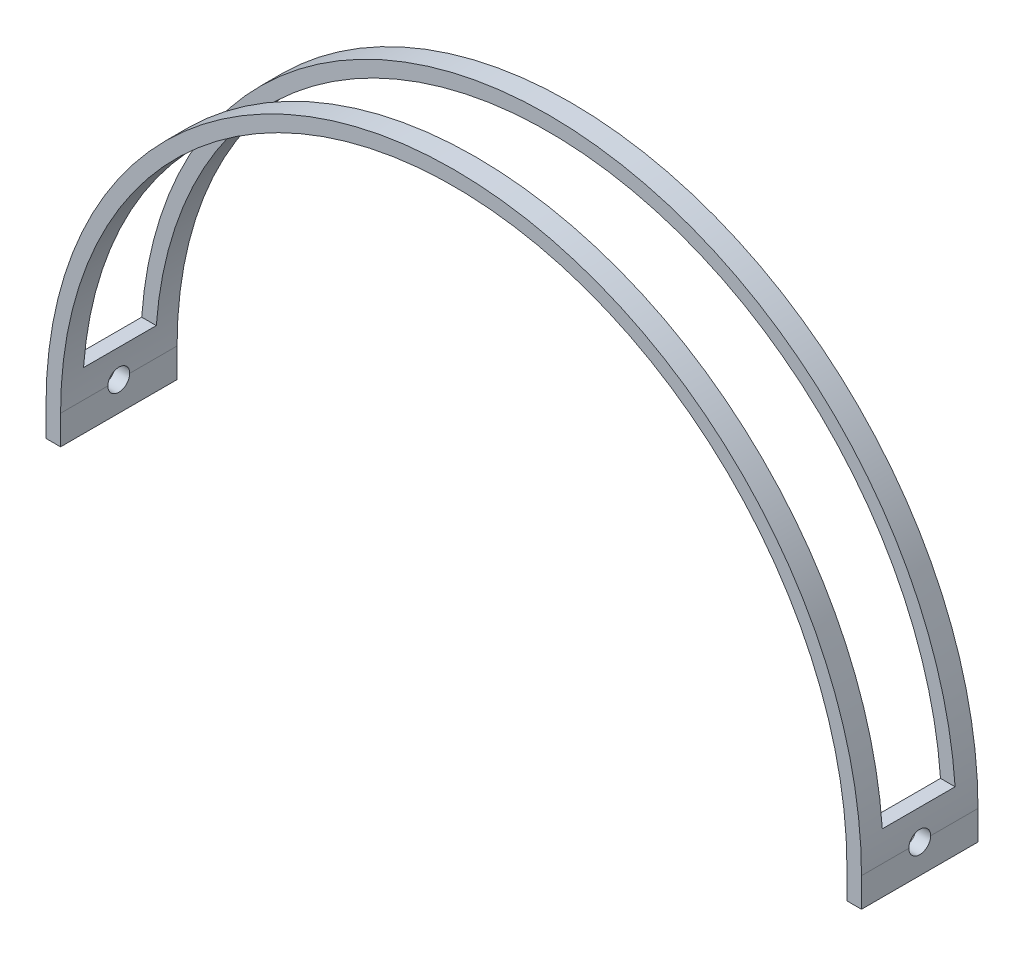
ISO-10303-21;
HEADER;
FILE_DESCRIPTION(('STEP AP214'),'2;1');
FILE_NAME('part.step','',(''),(''),'','','');
FILE_SCHEMA(('AUTOMOTIVE_DESIGN { 1 0 10303 214 1 1 1 1 }'));
ENDSEC;
DATA;
#1=APPLICATION_CONTEXT('core data for automotive mechanical design processes');
#2=APPLICATION_PROTOCOL_DEFINITION('international standard','automotive_design',2000,#1);
#3=PRODUCT_CONTEXT('',#1,'mechanical');
#4=PRODUCT('Part','Part','',(#3));
#5=PRODUCT_RELATED_PRODUCT_CATEGORY('part','',(#4));
#6=PRODUCT_DEFINITION_FORMATION('','',#4);
#7=PRODUCT_DEFINITION_CONTEXT('part definition',#1,'design');
#8=PRODUCT_DEFINITION('design','',#6,#7);
#9=PRODUCT_DEFINITION_SHAPE('','',#8);
#10=(LENGTH_UNIT() NAMED_UNIT(*) SI_UNIT(.MILLI.,.METRE.));
#11=(NAMED_UNIT(*) PLANE_ANGLE_UNIT() SI_UNIT($,.RADIAN.));
#12=(NAMED_UNIT(*) SI_UNIT($,.STERADIAN.) SOLID_ANGLE_UNIT());
#13=UNCERTAINTY_MEASURE_WITH_UNIT(LENGTH_MEASURE(1.E-05),#10,'distance_accuracy_value','');
#14=(GEOMETRIC_REPRESENTATION_CONTEXT(3) GLOBAL_UNCERTAINTY_ASSIGNED_CONTEXT((#13)) GLOBAL_UNIT_ASSIGNED_CONTEXT((#10,
#11,#12)) REPRESENTATION_CONTEXT('',''));
#15=CARTESIAN_POINT('',(0.,0.,0.));
#16=DIRECTION('',(0.,0.,1.));
#17=DIRECTION('',(1.,0.,0.));
#18=AXIS2_PLACEMENT_3D('',#15,#16,#17);
#19=CARTESIAN_POINT('',(0.,0.,80.));
#20=DIRECTION('',(0.,0.,-1.));
#21=DIRECTION('',(-1.,0.,0.));
#22=AXIS2_PLACEMENT_3D('',#19,#20,#21);
#23=CYLINDRICAL_SURFACE('',#22,270.);
#24=DIRECTION('',(0.,0.,-1.));
#25=VECTOR('',#24,1.);
#26=CARTESIAN_POINT('',(269.258240356725,20.,80.));
#27=LINE('',#26,#25);
#28=CARTESIAN_POINT('',(269.258240356725,20.,65.));
#29=VERTEX_POINT('',#28);
#30=CARTESIAN_POINT('',(269.258240356725,20.,15.));
#31=VERTEX_POINT('',#30);
#32=EDGE_CURVE('E149',#29,#31,#27,.T.);
#33=ORIENTED_EDGE('',*,*,#32,.T.);
#34=CARTESIAN_POINT('',(0.,0.,15.));
#35=DIRECTION('',(0.,0.,-1.));
#36=DIRECTION('',(0.,1.,0.));
#37=AXIS2_PLACEMENT_3D('',#34,#35,#36);
#38=CIRCLE('',#37,270.);
#39=CARTESIAN_POINT('',(-269.258240356725,20.,15.));
#40=VERTEX_POINT('',#39);
#41=EDGE_CURVE('E163',#31,#40,#38,.F.);
#42=ORIENTED_EDGE('',*,*,#41,.T.);
#43=DIRECTION('',(0.,0.,-1.));
#44=VECTOR('',#43,1.);
#45=CARTESIAN_POINT('',(-269.258240356725,20.,80.));
#46=LINE('',#45,#44);
#47=CARTESIAN_POINT('',(-269.258240356725,20.,65.));
#48=VERTEX_POINT('',#47);
#49=EDGE_CURVE('E155',#40,#48,#46,.F.);
#50=ORIENTED_EDGE('',*,*,#49,.T.);
#51=CARTESIAN_POINT('',(0.,0.,65.));
#52=DIRECTION('',(0.,0.,1.));
#53=DIRECTION('',(0.,-1.,0.));
#54=AXIS2_PLACEMENT_3D('',#51,#52,#53);
#55=CIRCLE('',#54,270.);
#56=EDGE_CURVE('E144',#48,#29,#55,.F.);
#57=ORIENTED_EDGE('',*,*,#56,.T.);
#58=EDGE_LOOP('',(#33,#42,#50,#57));
#59=FACE_BOUND('',#58,.T.);
#60=DIRECTION('',(0.,0.,-1.));
#61=VECTOR('',#60,1.);
#62=CARTESIAN_POINT('',(270.,0.,80.));
#63=LINE('',#62,#61);
#64=CARTESIAN_POINT('',(270.,0.,32.5));
#65=VERTEX_POINT('',#64);
#66=CARTESIAN_POINT('',(270.,0.,0.));
#67=VERTEX_POINT('',#66);
#68=EDGE_CURVE('E241',#65,#67,#63,.T.);
#69=ORIENTED_EDGE('',*,*,#68,.F.);
#70=CARTESIAN_POINT('',(270.,0.,32.5));
#71=CARTESIAN_POINT('',(270.000002490355,0.210896671625209,32.4999772748572));
#72=CARTESIAN_POINT('',(269.999752988114,0.421790022561387,32.5088945265499));
#73=CARTESIAN_POINT('',(269.998767996086,0.842067134340722,32.5444448063949));
#74=CARTESIAN_POINT('',(269.998032530259,1.05145096909655,32.5710769611086));
#75=CARTESIAN_POINT('',(269.99609430199,1.46707781561305,32.6418674581378));
#76=CARTESIAN_POINT('',(269.994891875695,1.67332297604451,32.6860131936302));
#77=CARTESIAN_POINT('',(269.992054596659,2.08135936270014,32.7915090379145));
#78=CARTESIAN_POINT('',(269.990419749043,2.28315064167234,32.8528589428366));
#79=CARTESIAN_POINT('',(269.98676325086,2.68090410203583,32.9923482114205));
#80=CARTESIAN_POINT('',(269.984741492465,2.87686464083203,33.0704922561711));
#81=CARTESIAN_POINT('',(269.980368059072,3.26157709995361,33.2430351156936));
#82=CARTESIAN_POINT('',(269.978016262452,3.45032633006901,33.3374399256499));
#83=CARTESIAN_POINT('',(269.973051002591,3.81912758752038,33.5417735222238));
#84=CARTESIAN_POINT('',(269.970437640094,3.99918292407978,33.6516963385835));
#85=CARTESIAN_POINT('',(269.9650225652,4.34939856627714,33.8863139688));
#86=CARTESIAN_POINT('',(269.962220849825,4.51955871538725,34.0110090162379));
#87=CARTESIAN_POINT('',(269.956507857027,4.84881315928157,34.2743160663547));
#88=CARTESIAN_POINT('',(269.95359655318,5.00790475863382,34.4129314389933));
#89=CARTESIAN_POINT('',(269.947747549879,5.3138506982294,34.7030727741305));
#90=CARTESIAN_POINT('',(269.944809849799,5.4607047476853,34.8545990432437));
#91=CARTESIAN_POINT('',(269.938991570705,5.74112384240071,35.1694781303519));
#92=CARTESIAN_POINT('',(269.936110989842,5.87468931824805,35.3328305648487));
#93=CARTESIAN_POINT('',(269.930487615895,6.12763170232405,35.6702649605877));
#94=CARTESIAN_POINT('',(269.927744870873,6.24700368088501,35.8443506179859));
#95=CARTESIAN_POINT('',(269.922476767352,6.47062963500449,36.2019205178214));
#96=CARTESIAN_POINT('',(269.919951357087,6.57488721466033,36.3854025054926));
#97=CARTESIAN_POINT('',(269.915188019901,6.76761232018099,36.7605690317181));
#98=CARTESIAN_POINT('',(269.912950199163,6.85607401857797,36.9522565652899));
#99=CARTESIAN_POINT('',(269.908827273339,7.0165092565377,37.3423570956473));
#100=CARTESIAN_POINT('',(269.906942076783,7.08848707307027,37.5407683325029));
#101=CARTESIAN_POINT('',(269.903577214155,7.21547261851232,37.9429569701831));
#102=CARTESIAN_POINT('',(269.902097556531,7.27047999385168,38.1467344827152));
#103=CARTESIAN_POINT('',(269.899586198478,7.36311885456479,38.5581502315254));
#104=CARTESIAN_POINT('',(269.898554385139,7.40075471972331,38.7657874809201));
#105=CARTESIAN_POINT('',(269.896967490424,7.45840283010884,39.1834963248525));
#106=CARTESIAN_POINT('',(269.896412409614,7.47841505439742,39.3935679222821));
#107=CARTESIAN_POINT('',(269.895794747158,7.50067347247792,39.814657549159));
#108=CARTESIAN_POINT('',(269.895732180905,7.5029191109429,40.0256756079833));
#109=CARTESIAN_POINT('',(269.896101362578,7.48962702957873,40.4471459485791));
#110=CARTESIAN_POINT('',(269.896533099977,7.47408968839474,40.6575982423015));
#111=CARTESIAN_POINT('',(269.897878531865,7.42534557050848,41.07642279743));
#112=CARTESIAN_POINT('',(269.898792176307,7.39214062859547,41.2847952725375));
#113=CARTESIAN_POINT('',(269.901075039455,7.30831357705489,41.6979293464696));
#114=CARTESIAN_POINT('',(269.902444100896,7.25769747963791,41.9026921661129));
#115=CARTESIAN_POINT('',(269.905599301457,7.13939522458575,42.30726290104));
#116=CARTESIAN_POINT('',(269.907385516244,7.07170596988417,42.5070699101106));
#117=CARTESIAN_POINT('',(269.911324132071,6.91974547840534,42.9002664369441));
#118=CARTESIAN_POINT('',(269.913476524651,6.83547462470611,43.0936561028436));
#119=CARTESIAN_POINT('',(269.918086865011,6.65093217146744,43.4726847145102));
#120=CARTESIAN_POINT('',(269.920544869383,6.55065760743306,43.6583222162283));
#121=CARTESIAN_POINT('',(269.925696310504,6.33483361160142,44.0204873298012));
#122=CARTESIAN_POINT('',(269.928389743658,6.21928441312816,44.1970150807526));
#123=CARTESIAN_POINT('',(269.93393604824,5.97371320228065,44.5397354107952));
#124=CARTESIAN_POINT('',(269.936788942754,5.84368909174088,44.7059264861098));
#125=CARTESIAN_POINT('',(269.942571784152,5.57015605869184,45.0267061941021));
#126=CARTESIAN_POINT('',(269.945501702236,5.42665212654546,45.1812990827163));
#127=CARTESIAN_POINT('',(269.951358175564,5.127053103881,45.4779366273703));
#128=CARTESIAN_POINT('',(269.954284727994,4.97095098456519,45.619974184634));
#129=CARTESIAN_POINT('',(269.960048757042,4.64739073416951,45.8903473828512));
#130=CARTESIAN_POINT('',(269.962886264101,4.47993654705781,46.0186877430358));
#131=CARTESIAN_POINT('',(269.96839417829,4.13472536415256,46.2608725164716));
#132=CARTESIAN_POINT('',(269.97106450019,3.95696320089954,46.3747095660814));
#133=CARTESIAN_POINT('',(269.976160585946,3.59248192987508,46.5869985859129));
#134=CARTESIAN_POINT('',(269.978586357268,3.40576309578961,46.6854510258461));
#135=CARTESIAN_POINT('',(269.983126021495,3.02456854438496,46.8663324367272));
#136=CARTESIAN_POINT('',(269.985239712959,2.83008791896487,46.948751068985));
#137=CARTESIAN_POINT('',(269.989093215983,2.43486962561185,47.0968967286038));
#138=CARTESIAN_POINT('',(269.990833035759,2.23413209526456,47.1626241227049));
#139=CARTESIAN_POINT('',(269.993887427407,1.82809223962892,47.2768472496311));
#140=CARTESIAN_POINT('',(269.995202539664,1.62279607310506,47.325364887406));
#141=CARTESIAN_POINT('',(269.997372731815,1.20892631861051,47.4049218823215));
#142=CARTESIAN_POINT('',(269.998228037372,1.00035439012829,47.4359698135167));
#143=CARTESIAN_POINT('',(269.999226721046,0.659441838360513,47.4721226848181));
#144=CARTESIAN_POINT('',(269.999516613823,0.527646431958973,47.4825833201591));
#145=CARTESIAN_POINT('',(269.999903243148,0.263905249050726,47.496516985698));
#146=CARTESIAN_POINT('',(270.000000298562,0.131960082352581,47.5000015511986));
#147=CARTESIAN_POINT('',(270.,0.,47.5));
#148=B_SPLINE_CURVE_WITH_KNOTS('',3,(#70,#71,#72,#73,#74,#75,#76,#77,#78,#79,#80,#81,#82,#83,
#84,#85,#86,#87,#88,#89,#90,#91,#92,#93,#94,#95,#96,#97,#98,#99,#100,#101,#102,#103,#104,#105,
#106,#107,#108,#109,#110,#111,#112,#113,#114,#115,#116,#117,#118,#119,#120,#121,#122,#123,#124,
#125,#126,#127,#128,#129,#130,#131,#132,#133,#134,#135,#136,#137,#138,#139,#140,#141,#142,#143,
#144,#145,#146,#147),.UNSPECIFIED.,.F.,.F.,(4,2,2,2,2,2,2,2,2,2,2,2,2,2,2,2,2,2,2,2,2,2,2,2,2,2,
2,2,2,2,2,2,2,2,2,2,2,2,4),(0.,0.632496732573111,1.26496228201443,1.89697338664046,
2.52897700223854,3.16115700739397,3.7935705919644,4.42574152717239,5.0579224597101,
5.69025680702971,6.32260617553205,6.95493504742569,7.58748290140814,8.21987967249564,
8.85250926958298,9.48497453578103,10.1174529781665,10.7497718699665,11.3820915130155,
12.0144309202865,12.6467568636835,13.2790171525252,13.9110593356575,14.5432162536418,
15.1753585688733,15.8076181170683,16.4398680084508,17.0722096652576,17.7043181387103,
18.3367817499044,18.9690267438408,19.601591473592,20.2341368865742,20.8670888262903,
21.5000268575725,22.1321563561381,22.7639753371222,23.1604360053802,23.5562405615626),.UNSPECIFIED.);
#149=CARTESIAN_POINT('',(270.,0.,47.5));
#150=VERTEX_POINT('',#149);
#151=EDGE_CURVE('E456',#65,#150,#148,.T.);
#152=ORIENTED_EDGE('',*,*,#151,.T.);
#153=CARTESIAN_POINT('',(270.,0.,80.));
#154=VERTEX_POINT('',#153);
#155=EDGE_CURVE('E233',#154,#150,#63,.T.);
#156=ORIENTED_EDGE('',*,*,#155,.F.);
#157=CARTESIAN_POINT('',(0.,0.,80.));
#158=DIRECTION('',(0.,0.,-1.));
#159=DIRECTION('',(1.,0.,0.));
#160=AXIS2_PLACEMENT_3D('',#157,#158,#159);
#161=CIRCLE('',#160,270.);
#162=CARTESIAN_POINT('',(-270.,0.,80.));
#163=VERTEX_POINT('',#162);
#164=EDGE_CURVE('E401',#163,#154,#161,.T.);
#165=ORIENTED_EDGE('',*,*,#164,.F.);
#166=DIRECTION('',(0.,0.,-1.));
#167=VECTOR('',#166,1.);
#168=CARTESIAN_POINT('',(-270.,0.,80.));
#169=LINE('',#168,#167);
#170=CARTESIAN_POINT('',(-270.,0.,47.5));
#171=VERTEX_POINT('',#170);
#172=EDGE_CURVE('E396',#163,#171,#169,.T.);
#173=ORIENTED_EDGE('',*,*,#172,.T.);
#174=CARTESIAN_POINT('',(-270.,0.,47.5));
#175=CARTESIAN_POINT('',(-270.000002490355,0.210896671625175,47.5000227251428));
#176=CARTESIAN_POINT('',(-269.999752988114,0.421790022561354,47.4911054734501));
#177=CARTESIAN_POINT('',(-269.998767996086,0.842067134340689,47.4555551936051));
#178=CARTESIAN_POINT('',(-269.998032530259,1.05145096909652,47.4289230388914));
#179=CARTESIAN_POINT('',(-269.99609430199,1.46707781561301,47.3581325418622));
#180=CARTESIAN_POINT('',(-269.994891875695,1.67332297604447,47.3139868063698));
#181=CARTESIAN_POINT('',(-269.992054596659,2.08135936270011,47.2084909620855));
#182=CARTESIAN_POINT('',(-269.990419749043,2.2831506416723,47.1471410571634));
#183=CARTESIAN_POINT('',(-269.98676325086,2.6809041020358,47.0076517885795));
#184=CARTESIAN_POINT('',(-269.984741492465,2.87686464083199,46.929507743829));
#185=CARTESIAN_POINT('',(-269.980368059072,3.26157709995358,46.7569648843064));
#186=CARTESIAN_POINT('',(-269.978016262452,3.45032633006898,46.6625600743501));
#187=CARTESIAN_POINT('',(-269.973051002591,3.81912758752035,46.4582264777762));
#188=CARTESIAN_POINT('',(-269.970437640094,3.99918292407975,46.3483036614165));
#189=CARTESIAN_POINT('',(-269.9650225652,4.34939856627711,46.1136860312));
#190=CARTESIAN_POINT('',(-269.962220849825,4.51955871538722,45.9889909837621));
#191=CARTESIAN_POINT('',(-269.956507857027,4.84881315928154,45.7256839336453));
#192=CARTESIAN_POINT('',(-269.95359655318,5.00790475863379,45.5870685610068));
#193=CARTESIAN_POINT('',(-269.947747549879,5.31385069822937,45.2969272258695));
#194=CARTESIAN_POINT('',(-269.944809849799,5.46070474768528,45.1454009567563));
#195=CARTESIAN_POINT('',(-269.938991570705,5.74112384240068,44.8305218696482));
#196=CARTESIAN_POINT('',(-269.936110989842,5.87468931824803,44.6671694351513));
#197=CARTESIAN_POINT('',(-269.930487615895,6.12763170232403,44.3297350394123));
#198=CARTESIAN_POINT('',(-269.927744870873,6.24700368088499,44.1556493820141));
#199=CARTESIAN_POINT('',(-269.922476767352,6.47062963500447,43.7980794821786));
#200=CARTESIAN_POINT('',(-269.919951357087,6.57488721466031,43.6145974945075));
#201=CARTESIAN_POINT('',(-269.915188019901,6.76761232018097,43.239430968282));
#202=CARTESIAN_POINT('',(-269.912950199163,6.85607401857795,43.0477434347101));
#203=CARTESIAN_POINT('',(-269.908827273339,7.01650925653769,42.6576429043527));
#204=CARTESIAN_POINT('',(-269.906942076783,7.08848707307026,42.4592316674971));
#205=CARTESIAN_POINT('',(-269.903577214155,7.2154726185123,42.0570430298169));
#206=CARTESIAN_POINT('',(-269.902097556531,7.27047999385167,41.8532655172848));
#207=CARTESIAN_POINT('',(-269.899586198478,7.36311885456479,41.4418497684746));
#208=CARTESIAN_POINT('',(-269.898554385139,7.40075471972331,41.2342125190799));
#209=CARTESIAN_POINT('',(-269.896967490424,7.45840283010883,40.8165036751475));
#210=CARTESIAN_POINT('',(-269.896412409614,7.47841505439742,40.6064320777179));
#211=CARTESIAN_POINT('',(-269.895794747158,7.50067347247792,40.1853424508411));
#212=CARTESIAN_POINT('',(-269.895732180905,7.5029191109429,39.9743243920168));
#213=CARTESIAN_POINT('',(-269.896101362578,7.48962702957873,39.552854051421));
#214=CARTESIAN_POINT('',(-269.896533099977,7.47408968839474,39.3424017576985));
#215=CARTESIAN_POINT('',(-269.897878531865,7.42534557050849,38.92357720257));
#216=CARTESIAN_POINT('',(-269.898792176307,7.39214062859548,38.7152047274625));
#217=CARTESIAN_POINT('',(-269.901075039455,7.3083135770549,38.3020706535304));
#218=CARTESIAN_POINT('',(-269.902444100896,7.25769747963792,38.0973078338872));
#219=CARTESIAN_POINT('',(-269.905599301457,7.13939522458576,37.6927370989601));
#220=CARTESIAN_POINT('',(-269.907385516244,7.07170596988418,37.4929300898894));
#221=CARTESIAN_POINT('',(-269.911324132071,6.91974547840535,37.0997335630559));
#222=CARTESIAN_POINT('',(-269.913476524651,6.83547462470612,36.9063438971564));
#223=CARTESIAN_POINT('',(-269.918086865011,6.65093217146745,36.5273152854899));
#224=CARTESIAN_POINT('',(-269.920544869383,6.55065760743307,36.3416777837717));
#225=CARTESIAN_POINT('',(-269.925696310504,6.33483361160144,35.9795126701988));
#226=CARTESIAN_POINT('',(-269.928389743658,6.21928441312818,35.8029849192474));
#227=CARTESIAN_POINT('',(-269.93393604824,5.97371320228067,35.4602645892049));
#228=CARTESIAN_POINT('',(-269.936788942754,5.8436890917409,35.2940735138903));
#229=CARTESIAN_POINT('',(-269.942571784152,5.57015605869187,34.9732938058979));
#230=CARTESIAN_POINT('',(-269.945501702236,5.42665212654549,34.8187009172837));
#231=CARTESIAN_POINT('',(-269.951358175564,5.12705310388103,34.5220633726298));
#232=CARTESIAN_POINT('',(-269.954284727994,4.97095098456521,34.380025815366));
#233=CARTESIAN_POINT('',(-269.960048757042,4.64739073416953,34.1096526171488));
#234=CARTESIAN_POINT('',(-269.962886264101,4.47993654705783,33.9813122569642));
#235=CARTESIAN_POINT('',(-269.96839417829,4.13472536415259,33.7391274835284));
#236=CARTESIAN_POINT('',(-269.97106450019,3.95696320089957,33.6252904339186));
#237=CARTESIAN_POINT('',(-269.976160585946,3.59248192987511,33.4130014140871));
#238=CARTESIAN_POINT('',(-269.978586357268,3.40576309578964,33.314548974154));
#239=CARTESIAN_POINT('',(-269.983126021495,3.02456854438499,33.1336675632729));
#240=CARTESIAN_POINT('',(-269.985239712959,2.83008791896491,33.051248931015));
#241=CARTESIAN_POINT('',(-269.989093215983,2.43486962561188,32.9031032713962));
#242=CARTESIAN_POINT('',(-269.990833035759,2.23413209526459,32.8373758772951));
#243=CARTESIAN_POINT('',(-269.993887427407,1.82809223962896,32.7231527503689));
#244=CARTESIAN_POINT('',(-269.995202539664,1.62279607310509,32.674635112594));
#245=CARTESIAN_POINT('',(-269.997372731815,1.20892631861055,32.5950781176785));
#246=CARTESIAN_POINT('',(-269.998228037372,1.00035439012833,32.5640301864834));
#247=CARTESIAN_POINT('',(-269.999226721046,0.659441838360539,32.5278773151819));
#248=CARTESIAN_POINT('',(-269.999516613823,0.527646431958987,32.5174166798409));
#249=CARTESIAN_POINT('',(-269.999903243148,0.263905249050718,32.503483014302));
#250=CARTESIAN_POINT('',(-270.000000298562,0.13196008235256,32.4999984488014));
#251=CARTESIAN_POINT('',(-270.,0.,32.5));
#252=B_SPLINE_CURVE_WITH_KNOTS('',3,(#174,#175,#176,#177,#178,#179,#180,#181,#182,#183,#184,
#185,#186,#187,#188,#189,#190,#191,#192,#193,#194,#195,#196,#197,#198,#199,#200,#201,#202,#203,
#204,#205,#206,#207,#208,#209,#210,#211,#212,#213,#214,#215,#216,#217,#218,#219,#220,#221,#222,
#223,#224,#225,#226,#227,#228,#229,#230,#231,#232,#233,#234,#235,#236,#237,#238,#239,#240,#241,
#242,#243,#244,#245,#246,#247,#248,#249,#250,#251),.UNSPECIFIED.,.F.,.F.,(4,2,2,2,2,2,2,2,2,2,2,
2,2,2,2,2,2,2,2,2,2,2,2,2,2,2,2,2,2,2,2,2,2,2,2,2,2,2,4),(0.,0.632496732573112,1.26496228201443,
1.89697338664046,2.52897700223854,3.16115700739396,3.7935705919644,4.42574152717239,
5.0579224597101,5.69025680702972,6.32260617553205,6.95493504742569,7.58748290140814,
8.21987967249563,8.85250926958297,9.48497453578102,10.1174529781665,10.7497718699665,
11.3820915130155,12.0144309202865,12.6467568636834,13.2790171525252,13.9110593356575,
14.5432162536418,15.1753585688733,15.8076181170683,16.4398680084508,17.0722096652576,
17.7043181387103,18.3367817499044,18.9690267438408,19.601591473592,20.2341368865742,
20.8670888262903,21.5000268575725,22.1321563561381,22.7639753371222,23.1604360053802,
23.5562405615626),.UNSPECIFIED.);
#253=CARTESIAN_POINT('',(-270.,0.,32.5));
#254=VERTEX_POINT('',#253);
#255=EDGE_CURVE('E172',#171,#254,#252,.T.);
#256=ORIENTED_EDGE('',*,*,#255,.T.);
#257=CARTESIAN_POINT('',(-270.,0.,0.));
#258=VERTEX_POINT('',#257);
#259=EDGE_CURVE('E407',#254,#258,#169,.T.);
#260=ORIENTED_EDGE('',*,*,#259,.T.);
#261=CARTESIAN_POINT('',(0.,0.,0.));
#262=DIRECTION('',(0.,0.,-1.));
#263=DIRECTION('',(1.,0.,0.));
#264=AXIS2_PLACEMENT_3D('',#261,#262,#263);
#265=CIRCLE('',#264,270.);
#266=EDGE_CURVE('E400',#258,#67,#265,.T.);
#267=ORIENTED_EDGE('',*,*,#266,.T.);
#268=EDGE_LOOP('',(#69,#152,#156,#165,#173,#256,#260,#267));
#269=FACE_BOUND('',#268,.T.);
#270=ADVANCED_FACE('F35',(#59,#269),#23,.F.);
#271=CARTESIAN_POINT('',(270.,0.,80.));
#272=DIRECTION('',(1.,0.,0.));
#273=DIRECTION('',(0.,0.,-1.));
#274=AXIS2_PLACEMENT_3D('',#271,#272,#273);
#275=PLANE('',#274);
#276=ORIENTED_EDGE('',*,*,#155,.T.);
#277=CARTESIAN_POINT('',(270.,0.,40.));
#278=DIRECTION('',(1.,0.,0.));
#279=DIRECTION('',(0.,0.,-1.));
#280=AXIS2_PLACEMENT_3D('',#277,#278,#279);
#281=CIRCLE('',#280,7.5);
#282=EDGE_CURVE('E207',#150,#65,#281,.T.);
#283=ORIENTED_EDGE('',*,*,#282,.T.);
#284=ORIENTED_EDGE('',*,*,#68,.T.);
#285=DIRECTION('',(0.,-1.,0.));
#286=VECTOR('',#285,1.);
#287=CARTESIAN_POINT('',(270.,0.,0.));
#288=LINE('',#287,#286);
#289=CARTESIAN_POINT('',(270.,-20.,0.));
#290=VERTEX_POINT('',#289);
#291=EDGE_CURVE('E428',#67,#290,#288,.T.);
#292=ORIENTED_EDGE('',*,*,#291,.T.);
#293=DIRECTION('',(0.,0.,-1.));
#294=VECTOR('',#293,1.);
#295=CARTESIAN_POINT('',(270.,-20.,80.));
#296=LINE('',#295,#294);
#297=CARTESIAN_POINT('',(270.,-20.,80.));
#298=VERTEX_POINT('',#297);
#299=EDGE_CURVE('E246',#298,#290,#296,.T.);
#300=ORIENTED_EDGE('',*,*,#299,.F.);
#301=DIRECTION('',(0.,-1.,0.));
#302=VECTOR('',#301,1.);
#303=CARTESIAN_POINT('',(270.,0.,80.));
#304=LINE('',#303,#302);
#305=EDGE_CURVE('E236',#154,#298,#304,.T.);
#306=ORIENTED_EDGE('',*,*,#305,.F.);
#307=EDGE_LOOP('',(#276,#283,#284,#292,#300,#306));
#308=FACE_BOUND('',#307,.T.);
#309=ADVANCED_FACE('F223',(#308),#275,.F.);
#310=CARTESIAN_POINT('',(270.,-20.,80.));
#311=DIRECTION('',(0.,1.,0.));
#312=DIRECTION('',(0.,0.,1.));
#313=AXIS2_PLACEMENT_3D('',#310,#311,#312);
#314=PLANE('',#313);
#315=DIRECTION('',(1.,0.,0.));
#316=VECTOR('',#315,1.);
#317=CARTESIAN_POINT('',(270.,-20.,0.));
#318=LINE('',#317,#316);
#319=CARTESIAN_POINT('',(280.,-20.,0.));
#320=VERTEX_POINT('',#319);
#321=EDGE_CURVE('E426',#290,#320,#318,.T.);
#322=ORIENTED_EDGE('',*,*,#321,.T.);
#323=DIRECTION('',(0.,0.,-1.));
#324=VECTOR('',#323,1.);
#325=CARTESIAN_POINT('',(280.,-20.,80.));
#326=LINE('',#325,#324);
#327=CARTESIAN_POINT('',(280.,-20.,80.));
#328=VERTEX_POINT('',#327);
#329=EDGE_CURVE('E417',#328,#320,#326,.T.);
#330=ORIENTED_EDGE('',*,*,#329,.F.);
#331=DIRECTION('',(1.,0.,0.));
#332=VECTOR('',#331,1.);
#333=CARTESIAN_POINT('',(270.,-20.,80.));
#334=LINE('',#333,#332);
#335=EDGE_CURVE('E427',#298,#328,#334,.T.);
#336=ORIENTED_EDGE('',*,*,#335,.F.);
#337=ORIENTED_EDGE('',*,*,#299,.T.);
#338=EDGE_LOOP('',(#322,#330,#336,#337));
#339=FACE_BOUND('',#338,.T.);
#340=ADVANCED_FACE('F220',(#339),#314,.F.);
#341=CARTESIAN_POINT('',(280.,0.,80.));
#342=DIRECTION('',(-1.,0.,0.));
#343=DIRECTION('',(0.,0.,1.));
#344=AXIS2_PLACEMENT_3D('',#341,#342,#343);
#345=PLANE('',#344);
#346=DIRECTION('',(0.,0.,-1.));
#347=VECTOR('',#346,1.);
#348=CARTESIAN_POINT('',(280.,0.,80.));
#349=LINE('',#348,#347);
#350=CARTESIAN_POINT('',(280.,0.,32.5));
#351=VERTEX_POINT('',#350);
#352=CARTESIAN_POINT('',(280.,0.,0.));
#353=VERTEX_POINT('',#352);
#354=EDGE_CURVE('E414',#351,#353,#349,.T.);
#355=ORIENTED_EDGE('',*,*,#354,.F.);
#356=CARTESIAN_POINT('',(280.,0.,40.));
#357=DIRECTION('',(1.,0.,0.));
#358=DIRECTION('',(0.,0.,-1.));
#359=AXIS2_PLACEMENT_3D('',#356,#357,#358);
#360=CIRCLE('',#359,7.5);
#361=CARTESIAN_POINT('',(280.,0.,47.5));
#362=VERTEX_POINT('',#361);
#363=EDGE_CURVE('E165',#362,#351,#360,.T.);
#364=ORIENTED_EDGE('',*,*,#363,.F.);
#365=CARTESIAN_POINT('',(280.,0.,80.));
#366=VERTEX_POINT('',#365);
#367=EDGE_CURVE('E415',#366,#362,#349,.T.);
#368=ORIENTED_EDGE('',*,*,#367,.F.);
#369=DIRECTION('',(0.,1.,0.));
#370=VECTOR('',#369,1.);
#371=CARTESIAN_POINT('',(280.,0.,80.));
#372=LINE('',#371,#370);
#373=EDGE_CURVE('E448',#328,#366,#372,.T.);
#374=ORIENTED_EDGE('',*,*,#373,.F.);
#375=ORIENTED_EDGE('',*,*,#329,.T.);
#376=DIRECTION('',(0.,1.,0.));
#377=VECTOR('',#376,1.);
#378=CARTESIAN_POINT('',(280.,0.,0.));
#379=LINE('',#378,#377);
#380=EDGE_CURVE('E430',#320,#353,#379,.T.);
#381=ORIENTED_EDGE('',*,*,#380,.T.);
#382=EDGE_LOOP('',(#355,#364,#368,#374,#375,#381));
#383=FACE_BOUND('',#382,.T.);
#384=ADVANCED_FACE('F214',(#383),#345,.F.);
#385=CARTESIAN_POINT('',(0.,0.,80.));
#386=DIRECTION('',(0.,0.,-1.));
#387=DIRECTION('',(-1.,0.,0.));
#388=AXIS2_PLACEMENT_3D('',#385,#386,#387);
#389=CYLINDRICAL_SURFACE('',#388,280.);
#390=CARTESIAN_POINT('',(0.,0.,15.));
#391=DIRECTION('',(0.,0.,-1.));
#392=DIRECTION('',(0.,1.,0.));
#393=AXIS2_PLACEMENT_3D('',#390,#391,#392);
#394=CIRCLE('',#393,280.);
#395=CARTESIAN_POINT('',(-279.284800875379,20.,15.));
#396=VERTEX_POINT('',#395);
#397=CARTESIAN_POINT('',(279.284800875379,20.,15.));
#398=VERTEX_POINT('',#397);
#399=EDGE_CURVE('E11',#396,#398,#394,.T.);
#400=ORIENTED_EDGE('',*,*,#399,.T.);
#401=DIRECTION('',(0.,0.,-1.));
#402=VECTOR('',#401,1.);
#403=CARTESIAN_POINT('',(279.284800875379,20.,80.));
#404=LINE('',#403,#402);
#405=CARTESIAN_POINT('',(279.284800875379,20.,65.));
#406=VERTEX_POINT('',#405);
#407=EDGE_CURVE('E251',#398,#406,#404,.F.);
#408=ORIENTED_EDGE('',*,*,#407,.T.);
#409=CARTESIAN_POINT('',(0.,0.,65.));
#410=DIRECTION('',(0.,0.,1.));
#411=DIRECTION('',(0.,-1.,0.));
#412=AXIS2_PLACEMENT_3D('',#409,#410,#411);
#413=CIRCLE('',#412,280.);
#414=CARTESIAN_POINT('',(-279.284800875379,20.,65.));
#415=VERTEX_POINT('',#414);
#416=EDGE_CURVE('E244',#406,#415,#413,.T.);
#417=ORIENTED_EDGE('',*,*,#416,.T.);
#418=DIRECTION('',(0.,0.,-1.));
#419=VECTOR('',#418,1.);
#420=CARTESIAN_POINT('',(-279.284800875379,20.,80.));
#421=LINE('',#420,#419);
#422=EDGE_CURVE('E43',#415,#396,#421,.T.);
#423=ORIENTED_EDGE('',*,*,#422,.T.);
#424=EDGE_LOOP('',(#400,#408,#417,#423));
#425=FACE_BOUND('',#424,.T.);
#426=ORIENTED_EDGE('',*,*,#367,.T.);
#427=CARTESIAN_POINT('',(280.,0.,47.5));
#428=CARTESIAN_POINT('',(280.00000240153,0.210899699288154,47.5000227219922));
#429=CARTESIAN_POINT('',(279.999761803127,0.421796082105779,47.4911052178454));
#430=CARTESIAN_POINT('',(279.998811962089,0.842079291744775,47.4555539088124));
#431=CARTESIAN_POINT('',(279.998102742512,1.05146619232869,47.4289209756243));
#432=CARTESIAN_POINT('',(279.996233682274,1.46709941666009,47.3581283331769));
#433=CARTESIAN_POINT('',(279.995074165261,1.6733478857448,47.3139812116495));
#434=CARTESIAN_POINT('',(279.992338136932,2.08139086617777,47.2084819714669));
#435=CARTESIAN_POINT('',(279.990761630566,2.28318543036845,47.147130057053));
#436=CARTESIAN_POINT('',(279.987235619577,2.68094548340308,47.0076360757864));
#437=CARTESIAN_POINT('',(279.985286010787,2.87690932665352,46.9294893191795));
#438=CARTESIAN_POINT('',(279.981068654263,3.26162821446627,46.7569403416919));
#439=CARTESIAN_POINT('',(279.97880078925,3.45038056876214,46.6625321253943));
#440=CARTESIAN_POINT('',(279.974012738939,3.81918769794875,46.4581910719778));
#441=CARTESIAN_POINT('',(279.971492650884,3.99924578545633,46.3482642112904));
#442=CARTESIAN_POINT('',(279.966270858039,4.34946648822376,46.113637865492));
#443=CARTESIAN_POINT('',(279.963569150383,4.51962894715432,45.9889381470967));
#444=CARTESIAN_POINT('',(279.958060145081,4.84888465522169,45.7256234274722));
#445=CARTESIAN_POINT('',(279.955252823728,5.00797539580363,45.5870052899688));
#446=CARTESIAN_POINT('',(279.949612746509,5.31391933223625,45.2968584184432));
#447=CARTESIAN_POINT('',(279.946779990041,5.46077223742692,45.1453293779479));
#448=CARTESIAN_POINT('',(279.941169577679,5.74118870116377,44.8304448341287));
#449=CARTESIAN_POINT('',(279.938391920001,5.87475269029593,44.6670897142887));
#450=CARTESIAN_POINT('',(279.932969490776,6.12769172959765,44.3296501370494));
#451=CARTESIAN_POINT('',(279.930324765581,6.24706184995409,44.1555619835473));
#452=CARTESIAN_POINT('',(279.925244984396,6.47068244403977,43.7979894292084));
#453=CARTESIAN_POINT('',(279.922809876099,6.5749366941611,43.6145073907958));
#454=CARTESIAN_POINT('',(279.918216882468,6.76765518010038,43.2393413150671));
#455=CARTESIAN_POINT('',(279.916059099526,6.85611358856938,43.0476542829898));
#456=CARTESIAN_POINT('',(279.91208365207,7.01654237903159,42.6575553019042));
#457=CARTESIAN_POINT('',(279.91026589938,7.08851703667708,42.4591451121513));
#458=CARTESIAN_POINT('',(279.907021433944,7.21549648293134,42.056959097328));
#459=CARTESIAN_POINT('',(279.905594729355,7.27050091754313,41.8531831604249));
#460=CARTESIAN_POINT('',(279.903173242539,7.36313505540405,41.4417672509912));
#461=CARTESIAN_POINT('',(279.902178359351,7.40076882004653,41.2341281935102));
#462=CARTESIAN_POINT('',(279.900648296271,7.45841246216999,40.8164160323543));
#463=CARTESIAN_POINT('',(279.90011311693,7.47842231852748,40.6063429257621));
#464=CARTESIAN_POINT('',(279.899517662192,7.50067577959169,40.1852505096366));
#465=CARTESIAN_POINT('',(279.899457401698,7.50291882681412,39.9742311706203));
#466=CARTESIAN_POINT('',(279.899813532814,7.48962135821243,39.5527584696793));
#467=CARTESIAN_POINT('',(279.90022991428,7.47408122094145,39.3423050958024));
#468=CARTESIAN_POINT('',(279.901527425387,7.4253308285838,38.9234744514351));
#469=CARTESIAN_POINT('',(279.902408515811,7.39212206457556,38.7150970072658));
#470=CARTESIAN_POINT('',(279.904610008421,7.30828646772599,38.3019532800017));
#471=CARTESIAN_POINT('',(279.905930258956,7.25766564741344,38.0971857759892));
#472=CARTESIAN_POINT('',(279.908972948499,7.13935303838253,37.6926060388617));
#473=CARTESIAN_POINT('',(279.91069546046,7.07165815303536,37.492794711849));
#474=CARTESIAN_POINT('',(279.914493596699,6.91968549645852,37.0995900206056));
#475=CARTESIAN_POINT('',(279.916569212815,6.83540810858067,36.9061965081296));
#476=CARTESIAN_POINT('',(279.921015066537,6.65085261328882,36.5271626654565));
#477=CARTESIAN_POINT('',(279.923385355832,6.55057169775268,36.3415237031687));
#478=CARTESIAN_POINT('',(279.928352950648,6.33473447716944,35.9793562444735));
#479=CARTESIAN_POINT('',(279.930950252695,6.21917840578163,35.8028276087658));
#480=CARTESIAN_POINT('',(279.936298588719,5.9735930196671,35.4601062379031));
#481=CARTESIAN_POINT('',(279.939049644931,5.84356160882845,35.2939150051086));
#482=CARTESIAN_POINT('',(279.944626041166,5.57001365204813,34.973135813359));
#483=CARTESIAN_POINT('',(279.947451353419,5.42650209695372,34.8185435978531));
#484=CARTESIAN_POINT('',(279.953098646059,5.12689120951772,34.5219118653627));
#485=CARTESIAN_POINT('',(279.955920623837,4.97078514585974,34.3798791471211));
#486=CARTESIAN_POINT('',(279.961478663589,4.64721751663902,34.1095159691453));
#487=CARTESIAN_POINT('',(279.964214754925,4.47975989500674,33.9811807898972));
#488=CARTESIAN_POINT('',(279.969525785358,4.1345424314416,33.7390066936234));
#489=CARTESIAN_POINT('',(279.972100642245,3.95677742162568,33.6251751414393));
#490=CARTESIAN_POINT('',(279.977014513615,3.59229114144827,33.4128973849918));
#491=CARTESIAN_POINT('',(279.979353535297,3.40557014471311,33.3144507110753));
#492=CARTESIAN_POINT('',(279.983730821614,3.02437211821584,33.1335810734044));
#493=CARTESIAN_POINT('',(279.985768892163,2.82989018514632,33.0511684393688));
#494=CARTESIAN_POINT('',(279.989484494599,2.43467004659425,32.9030348382491));
#495=CARTESIAN_POINT('',(279.9911620344,2.23393197856755,32.8373135047241));
#496=CARTESIAN_POINT('',(279.994107046506,1.82789182555562,32.7231024485046));
#497=CARTESIAN_POINT('',(279.99537503995,1.62259589888537,32.6745908190883));
#498=CARTESIAN_POINT('',(279.997467422244,1.20872731486373,32.5950456795774));
#499=CARTESIAN_POINT('',(279.998292028708,1.00015631674214,32.5640035951016));
#500=CARTESIAN_POINT('',(279.999254710101,0.659277455388658,32.5278633931471));
#501=CARTESIAN_POINT('',(279.999534110277,0.527514790337227,32.5174079804113));
#502=CARTESIAN_POINT('',(279.999906745345,0.263839314994674,32.5034812743999));
#503=CARTESIAN_POINT('',(280.000000287538,0.131927113976483,32.499998452451));
#504=CARTESIAN_POINT('',(280.,0.,32.5));
#505=B_SPLINE_CURVE_WITH_KNOTS('',3,(#427,#428,#429,#430,#431,#432,#433,#434,#435,#436,#437,
#438,#439,#440,#441,#442,#443,#444,#445,#446,#447,#448,#449,#450,#451,#452,#453,#454,#455,#456,
#457,#458,#459,#460,#461,#462,#463,#464,#465,#466,#467,#468,#469,#470,#471,#472,#473,#474,#475,
#476,#477,#478,#479,#480,#481,#482,#483,#484,#485,#486,#487,#488,#489,#490,#491,#492,#493,#494,
#495,#496,#497,#498,#499,#500,#501,#502,#503,#504),.UNSPECIFIED.,.F.,.F.,(4,2,2,2,2,2,2,2,2,2,2,
2,2,2,2,2,2,2,2,2,2,2,2,2,2,2,2,2,2,2,2,2,2,2,2,2,2,2,4),(0.,0.632505824681972,1.26498052884894,
1.89700148429622,2.52901493722799,3.16120510202618,3.79362884908282,4.42580970260537,
5.05800054049151,5.69033415267403,6.32268277909128,6.95501090954199,7.58755802257748,
8.21994683330145,8.85256846295378,9.48502581316585,10.1174963554764,10.7498189464152,
11.3821422952368,12.0144854849282,12.6468152140916,13.2790915885878,13.9111498515757,
14.5433228300103,15.1754811956813,15.8077506077258,16.4400103492621,17.0723617650116,
17.7044799768502,18.3369383003572,18.969178000818,19.6017374794673,20.234277644241,
20.8672239750248,21.5001564089009,22.1322802494599,22.7640935605446,23.1604551518375,
23.5561608449312),.UNSPECIFIED.);
#506=EDGE_CURVE('E201',#362,#351,#505,.T.);
#507=ORIENTED_EDGE('',*,*,#506,.T.);
#508=ORIENTED_EDGE('',*,*,#354,.T.);
#509=CARTESIAN_POINT('',(0.,0.,0.));
#510=DIRECTION('',(0.,0.,1.));
#511=DIRECTION('',(1.,0.,0.));
#512=AXIS2_PLACEMENT_3D('',#509,#510,#511);
#513=CIRCLE('',#512,280.);
#514=CARTESIAN_POINT('',(-280.,0.,0.));
#515=VERTEX_POINT('',#514);
#516=EDGE_CURVE('E432',#353,#515,#513,.T.);
#517=ORIENTED_EDGE('',*,*,#516,.T.);
#518=DIRECTION('',(0.,0.,-1.));
#519=VECTOR('',#518,1.);
#520=CARTESIAN_POINT('',(-280.,0.,80.));
#521=LINE('',#520,#519);
#522=CARTESIAN_POINT('',(-280.,0.,32.5));
#523=VERTEX_POINT('',#522);
#524=EDGE_CURVE('E410',#523,#515,#521,.T.);
#525=ORIENTED_EDGE('',*,*,#524,.F.);
#526=CARTESIAN_POINT('',(-280.,0.,32.5));
#527=CARTESIAN_POINT('',(-280.00000240153,0.210899699288119,32.4999772780078));
#528=CARTESIAN_POINT('',(-279.999761803127,0.421796082105744,32.5088947821546));
#529=CARTESIAN_POINT('',(-279.998811962089,0.842079291744741,32.5444460911876));
#530=CARTESIAN_POINT('',(-279.998102742512,1.05146619232866,32.5710790243757));
#531=CARTESIAN_POINT('',(-279.996233682274,1.46709941666005,32.6418716668231));
#532=CARTESIAN_POINT('',(-279.995074165261,1.67334788574476,32.6860187883505));
#533=CARTESIAN_POINT('',(-279.992338136932,2.08139086617773,32.7915180285331));
#534=CARTESIAN_POINT('',(-279.990761630566,2.28318543036842,32.852869942947));
#535=CARTESIAN_POINT('',(-279.987235619577,2.68094548340305,32.9923639242136));
#536=CARTESIAN_POINT('',(-279.985286010787,2.87690932665349,33.0705106808205));
#537=CARTESIAN_POINT('',(-279.981068654263,3.26162821446624,33.2430596583081));
#538=CARTESIAN_POINT('',(-279.97880078925,3.45038056876211,33.3374678746057));
#539=CARTESIAN_POINT('',(-279.974012738939,3.81918769794872,33.5418089280222));
#540=CARTESIAN_POINT('',(-279.971492650884,3.9992457854563,33.6517357887096));
#541=CARTESIAN_POINT('',(-279.966270858039,4.34946648822373,33.886362134508));
#542=CARTESIAN_POINT('',(-279.963569150383,4.5196289471543,34.0110618529033));
#543=CARTESIAN_POINT('',(-279.958060145081,4.84888465522166,34.2743765725278));
#544=CARTESIAN_POINT('',(-279.955252823728,5.00797539580361,34.4129947100312));
#545=CARTESIAN_POINT('',(-279.949612746509,5.31391933223622,34.7031415815568));
#546=CARTESIAN_POINT('',(-279.946779990041,5.4607722374269,34.8546706220521));
#547=CARTESIAN_POINT('',(-279.941169577679,5.74118870116376,35.1695551658712));
#548=CARTESIAN_POINT('',(-279.938391920001,5.87475269029591,35.3329102857113));
#549=CARTESIAN_POINT('',(-279.932969490776,6.12769172959763,35.6703498629506));
#550=CARTESIAN_POINT('',(-279.930324765581,6.24706184995408,35.8444380164527));
#551=CARTESIAN_POINT('',(-279.925244984396,6.47068244403975,36.2020105707916));
#552=CARTESIAN_POINT('',(-279.922809876099,6.57493669416109,36.3854926092042));
#553=CARTESIAN_POINT('',(-279.918216882468,6.76765518010037,36.7606586849328));
#554=CARTESIAN_POINT('',(-279.916059099526,6.85611358856937,36.9523457170102));
#555=CARTESIAN_POINT('',(-279.91208365207,7.01654237903158,37.3424446980958));
#556=CARTESIAN_POINT('',(-279.91026589938,7.08851703667707,37.5408548878486));
#557=CARTESIAN_POINT('',(-279.907021433944,7.21549648293132,37.9430409026719));
#558=CARTESIAN_POINT('',(-279.905594729355,7.27050091754312,38.146816839575));
#559=CARTESIAN_POINT('',(-279.903173242539,7.36313505540405,38.5582327490088));
#560=CARTESIAN_POINT('',(-279.902178359351,7.40076882004652,38.7658718064897));
#561=CARTESIAN_POINT('',(-279.900648296271,7.45841246216999,39.1835839676457));
#562=CARTESIAN_POINT('',(-279.90011311693,7.47842231852747,39.3936570742378));
#563=CARTESIAN_POINT('',(-279.899517662192,7.50067577959169,39.8147494903634));
#564=CARTESIAN_POINT('',(-279.899457401698,7.50291882681412,40.0257688293797));
#565=CARTESIAN_POINT('',(-279.899813532814,7.48962135821243,40.4472415303207));
#566=CARTESIAN_POINT('',(-279.90022991428,7.47408122094145,40.6576949041975));
#567=CARTESIAN_POINT('',(-279.901527425387,7.4253308285838,41.0765255485648));
#568=CARTESIAN_POINT('',(-279.902408515811,7.39212206457556,41.2849029927342));
#569=CARTESIAN_POINT('',(-279.904610008421,7.30828646772599,41.6980467199983));
#570=CARTESIAN_POINT('',(-279.905930258956,7.25766564741345,41.9028142240108));
#571=CARTESIAN_POINT('',(-279.908972948499,7.13935303838254,42.3073939611383));
#572=CARTESIAN_POINT('',(-279.91069546046,7.07165815303536,42.5072052881509));
#573=CARTESIAN_POINT('',(-279.914493596699,6.91968549645853,42.9004099793943));
#574=CARTESIAN_POINT('',(-279.916569212815,6.83540810858068,43.0938034918704));
#575=CARTESIAN_POINT('',(-279.921015066537,6.65085261328884,43.4728373345434));
#576=CARTESIAN_POINT('',(-279.923385355832,6.5505716977527,43.6584762968313));
#577=CARTESIAN_POINT('',(-279.928352950648,6.33473447716946,44.0206437555264));
#578=CARTESIAN_POINT('',(-279.930950252695,6.21917840578165,44.1971723912342));
#579=CARTESIAN_POINT('',(-279.936298588719,5.97359301966712,44.5398937620969));
#580=CARTESIAN_POINT('',(-279.939049644931,5.84356160882847,44.7060849948914));
#581=CARTESIAN_POINT('',(-279.944626041166,5.57001365204816,45.026864186641));
#582=CARTESIAN_POINT('',(-279.947451353419,5.42650209695374,45.1814564021469));
#583=CARTESIAN_POINT('',(-279.953098646059,5.12689120951775,45.4780881346373));
#584=CARTESIAN_POINT('',(-279.955920623837,4.97078514585977,45.6201208528789));
#585=CARTESIAN_POINT('',(-279.961478663589,4.64721751663906,45.8904840308547));
#586=CARTESIAN_POINT('',(-279.964214754925,4.47975989500677,46.0188192101027));
#587=CARTESIAN_POINT('',(-279.969525785358,4.13454243144164,46.2609933063766));
#588=CARTESIAN_POINT('',(-279.972100642245,3.95677742162572,46.3748248585607));
#589=CARTESIAN_POINT('',(-279.977014513615,3.5922911414483,46.5871026150082));
#590=CARTESIAN_POINT('',(-279.979353535297,3.40557014471314,46.6855492889247));
#591=CARTESIAN_POINT('',(-279.983730821614,3.02437211821587,46.8664189265956));
#592=CARTESIAN_POINT('',(-279.985768892163,2.82989018514636,46.9488315606312));
#593=CARTESIAN_POINT('',(-279.989484494599,2.43467004659429,47.0969651617509));
#594=CARTESIAN_POINT('',(-279.9911620344,2.23393197856758,47.1626864952759));
#595=CARTESIAN_POINT('',(-279.994107046506,1.82789182555565,47.2768975514954));
#596=CARTESIAN_POINT('',(-279.99537503995,1.6225958988854,47.3254091809117));
#597=CARTESIAN_POINT('',(-279.997467422244,1.20872731486376,47.4049543204226));
#598=CARTESIAN_POINT('',(-279.998292028708,1.00015631674218,47.4359964048984));
#599=CARTESIAN_POINT('',(-279.999254710101,0.659277455388681,47.4721366068529));
#600=CARTESIAN_POINT('',(-279.999534110277,0.527514790337239,47.4825920195887));
#601=CARTESIAN_POINT('',(-279.999906745345,0.263839314994662,47.4965187256001));
#602=CARTESIAN_POINT('',(-280.000000287538,0.13192711397646,47.500001547549));
#603=CARTESIAN_POINT('',(-280.,0.,47.5));
#604=B_SPLINE_CURVE_WITH_KNOTS('',3,(#526,#527,#528,#529,#530,#531,#532,#533,#534,#535,#536,
#537,#538,#539,#540,#541,#542,#543,#544,#545,#546,#547,#548,#549,#550,#551,#552,#553,#554,#555,
#556,#557,#558,#559,#560,#561,#562,#563,#564,#565,#566,#567,#568,#569,#570,#571,#572,#573,#574,
#575,#576,#577,#578,#579,#580,#581,#582,#583,#584,#585,#586,#587,#588,#589,#590,#591,#592,#593,
#594,#595,#596,#597,#598,#599,#600,#601,#602,#603),.UNSPECIFIED.,.F.,.F.,(4,2,2,2,2,2,2,2,2,2,2,
2,2,2,2,2,2,2,2,2,2,2,2,2,2,2,2,2,2,2,2,2,2,2,2,2,2,2,4),(0.,0.632505824681971,1.26498052884894,
1.89700148429622,2.52901493722799,3.16120510202618,3.79362884908282,4.42580970260538,
5.05800054049151,5.69033415267404,6.32268277909129,6.95501090954199,7.58755802257749,
8.21994683330145,8.85256846295379,9.48502581316584,10.1174963554764,10.7498189464152,
11.3821422952368,12.0144854849282,12.6468152140916,13.2790915885878,13.9111498515757,
14.5433228300103,15.1754811956813,15.8077506077258,16.4400103492621,17.0723617650116,
17.7044799768502,18.3369383003572,18.9691780008179,19.6017374794673,20.234277644241,
20.8672239750248,21.5001564089009,22.1322802494599,22.7640935605446,23.1604551518375,
23.5561608449313),.UNSPECIFIED.);
#605=CARTESIAN_POINT('',(-280.,0.,47.5));
#606=VERTEX_POINT('',#605);
#607=EDGE_CURVE('E180',#523,#606,#604,.T.);
#608=ORIENTED_EDGE('',*,*,#607,.T.);
#609=CARTESIAN_POINT('',(-280.,0.,80.));
#610=VERTEX_POINT('',#609);
#611=EDGE_CURVE('E411',#610,#606,#521,.T.);
#612=ORIENTED_EDGE('',*,*,#611,.F.);
#613=CARTESIAN_POINT('',(0.,0.,80.));
#614=DIRECTION('',(0.,0.,1.));
#615=DIRECTION('',(1.,0.,0.));
#616=AXIS2_PLACEMENT_3D('',#613,#614,#615);
#617=CIRCLE('',#616,280.);
#618=EDGE_CURVE('E446',#366,#610,#617,.T.);
#619=ORIENTED_EDGE('',*,*,#618,.F.);
#620=EDGE_LOOP('',(#426,#507,#508,#517,#525,#608,#612,#619));
#621=FACE_BOUND('',#620,.T.);
#622=ADVANCED_FACE('F208',(#425,#621),#389,.T.);
#623=CARTESIAN_POINT('',(-280.,0.,80.));
#624=DIRECTION('',(1.,0.,0.));
#625=DIRECTION('',(0.,0.,-1.));
#626=AXIS2_PLACEMENT_3D('',#623,#624,#625);
#627=PLANE('',#626);
#628=ORIENTED_EDGE('',*,*,#611,.T.);
#629=CARTESIAN_POINT('',(-280.,0.,40.));
#630=DIRECTION('',(1.,0.,0.));
#631=DIRECTION('',(0.,0.,-1.));
#632=AXIS2_PLACEMENT_3D('',#629,#630,#631);
#633=CIRCLE('',#632,7.5);
#634=EDGE_CURVE('E169',#606,#523,#633,.T.);
#635=ORIENTED_EDGE('',*,*,#634,.T.);
#636=ORIENTED_EDGE('',*,*,#524,.T.);
#637=DIRECTION('',(0.,-1.,0.));
#638=VECTOR('',#637,1.);
#639=CARTESIAN_POINT('',(-280.,0.,0.));
#640=LINE('',#639,#638);
#641=CARTESIAN_POINT('',(-280.,-20.,0.));
#642=VERTEX_POINT('',#641);
#643=EDGE_CURVE('E389',#515,#642,#640,.T.);
#644=ORIENTED_EDGE('',*,*,#643,.T.);
#645=DIRECTION('',(0.,0.,-1.));
#646=VECTOR('',#645,1.);
#647=CARTESIAN_POINT('',(-280.,-20.,80.));
#648=LINE('',#647,#646);
#649=CARTESIAN_POINT('',(-280.,-20.,80.));
#650=VERTEX_POINT('',#649);
#651=EDGE_CURVE('E385',#650,#642,#648,.T.);
#652=ORIENTED_EDGE('',*,*,#651,.F.);
#653=DIRECTION('',(0.,-1.,0.));
#654=VECTOR('',#653,1.);
#655=CARTESIAN_POINT('',(-280.,0.,80.));
#656=LINE('',#655,#654);
#657=EDGE_CURVE('E447',#610,#650,#656,.T.);
#658=ORIENTED_EDGE('',*,*,#657,.F.);
#659=EDGE_LOOP('',(#628,#635,#636,#644,#652,#658));
#660=FACE_BOUND('',#659,.T.);
#661=ADVANCED_FACE('F213',(#660),#627,.F.);
#662=CARTESIAN_POINT('',(-280.,-20.,80.));
#663=DIRECTION('',(0.,1.,0.));
#664=DIRECTION('',(0.,0.,1.));
#665=AXIS2_PLACEMENT_3D('',#662,#663,#664);
#666=PLANE('',#665);
#667=DIRECTION('',(1.,0.,0.));
#668=VECTOR('',#667,1.);
#669=CARTESIAN_POINT('',(-280.,-20.,0.));
#670=LINE('',#669,#668);
#671=CARTESIAN_POINT('',(-270.,-20.,0.));
#672=VERTEX_POINT('',#671);
#673=EDGE_CURVE('E379',#642,#672,#670,.T.);
#674=ORIENTED_EDGE('',*,*,#673,.T.);
#675=DIRECTION('',(0.,0.,-1.));
#676=VECTOR('',#675,1.);
#677=CARTESIAN_POINT('',(-270.,-20.,80.));
#678=LINE('',#677,#676);
#679=CARTESIAN_POINT('',(-270.,-20.,80.));
#680=VERTEX_POINT('',#679);
#681=EDGE_CURVE('E382',#680,#672,#678,.T.);
#682=ORIENTED_EDGE('',*,*,#681,.F.);
#683=DIRECTION('',(1.,0.,0.));
#684=VECTOR('',#683,1.);
#685=CARTESIAN_POINT('',(-280.,-20.,80.));
#686=LINE('',#685,#684);
#687=EDGE_CURVE('E450',#650,#680,#686,.T.);
#688=ORIENTED_EDGE('',*,*,#687,.F.);
#689=ORIENTED_EDGE('',*,*,#651,.T.);
#690=EDGE_LOOP('',(#674,#682,#688,#689));
#691=FACE_BOUND('',#690,.T.);
#692=ADVANCED_FACE('F329',(#691),#666,.F.);
#693=CARTESIAN_POINT('',(-270.,0.,80.));
#694=DIRECTION('',(-1.,0.,0.));
#695=DIRECTION('',(0.,0.,1.));
#696=AXIS2_PLACEMENT_3D('',#693,#694,#695);
#697=PLANE('',#696);
#698=ORIENTED_EDGE('',*,*,#259,.F.);
#699=CARTESIAN_POINT('',(-270.,0.,40.));
#700=DIRECTION('',(-1.,0.,0.));
#701=DIRECTION('',(0.,0.,1.));
#702=AXIS2_PLACEMENT_3D('',#699,#700,#701);
#703=CIRCLE('',#702,7.5);
#704=EDGE_CURVE('E240',#254,#171,#703,.T.);
#705=ORIENTED_EDGE('',*,*,#704,.T.);
#706=ORIENTED_EDGE('',*,*,#172,.F.);
#707=DIRECTION('',(0.,1.,0.));
#708=VECTOR('',#707,1.);
#709=CARTESIAN_POINT('',(-270.,0.,80.));
#710=LINE('',#709,#708);
#711=EDGE_CURVE('E395',#680,#163,#710,.T.);
#712=ORIENTED_EDGE('',*,*,#711,.F.);
#713=ORIENTED_EDGE('',*,*,#681,.T.);
#714=DIRECTION('',(0.,1.,0.));
#715=VECTOR('',#714,1.);
#716=CARTESIAN_POINT('',(-270.,0.,0.));
#717=LINE('',#716,#715);
#718=EDGE_CURVE('E388',#672,#258,#717,.T.);
#719=ORIENTED_EDGE('',*,*,#718,.T.);
#720=EDGE_LOOP('',(#698,#705,#706,#712,#713,#719));
#721=FACE_BOUND('',#720,.T.);
#722=ADVANCED_FACE('F324',(#721),#697,.F.);
#723=CARTESIAN_POINT('',(0.,0.,80.));
#724=DIRECTION('',(0.,0.,1.));
#725=DIRECTION('',(1.,0.,0.));
#726=AXIS2_PLACEMENT_3D('',#723,#724,#725);
#727=PLANE('',#726);
#728=ORIENTED_EDGE('',*,*,#164,.T.);
#729=ORIENTED_EDGE('',*,*,#305,.T.);
#730=ORIENTED_EDGE('',*,*,#335,.T.);
#731=ORIENTED_EDGE('',*,*,#373,.T.);
#732=ORIENTED_EDGE('',*,*,#618,.T.);
#733=ORIENTED_EDGE('',*,*,#657,.T.);
#734=ORIENTED_EDGE('',*,*,#687,.T.);
#735=ORIENTED_EDGE('',*,*,#711,.T.);
#736=EDGE_LOOP('',(#728,#729,#730,#731,#732,#733,#734,#735));
#737=FACE_BOUND('',#736,.T.);
#738=ADVANCED_FACE('F195',(#737),#727,.T.);
#739=CARTESIAN_POINT('',(0.,0.,0.));
#740=DIRECTION('',(0.,0.,1.));
#741=DIRECTION('',(1.,0.,0.));
#742=AXIS2_PLACEMENT_3D('',#739,#740,#741);
#743=PLANE('',#742);
#744=ORIENTED_EDGE('',*,*,#266,.F.);
#745=ORIENTED_EDGE('',*,*,#718,.F.);
#746=ORIENTED_EDGE('',*,*,#673,.F.);
#747=ORIENTED_EDGE('',*,*,#643,.F.);
#748=ORIENTED_EDGE('',*,*,#516,.F.);
#749=ORIENTED_EDGE('',*,*,#380,.F.);
#750=ORIENTED_EDGE('',*,*,#321,.F.);
#751=ORIENTED_EDGE('',*,*,#291,.F.);
#752=EDGE_LOOP('',(#744,#745,#746,#747,#748,#749,#750,#751));
#753=FACE_BOUND('',#752,.T.);
#754=ADVANCED_FACE('F317',(#753),#743,.F.);
#755=CARTESIAN_POINT('',(-280.,0.,40.));
#756=DIRECTION('',(1.,0.,0.));
#757=DIRECTION('',(0.,0.,-1.));
#758=AXIS2_PLACEMENT_3D('',#755,#756,#757);
#759=CYLINDRICAL_SURFACE('',#758,7.5);
#760=ORIENTED_EDGE('',*,*,#704,.F.);
#761=ORIENTED_EDGE('',*,*,#255,.F.);
#762=EDGE_LOOP('',(#760,#761));
#763=FACE_BOUND('',#762,.T.);
#764=ORIENTED_EDGE('',*,*,#634,.F.);
#765=ORIENTED_EDGE('',*,*,#607,.F.);
#766=EDGE_LOOP('',(#764,#765));
#767=FACE_BOUND('',#766,.T.);
#768=ADVANCED_FACE('F192',(#763,#767),#759,.F.);
#769=ORIENTED_EDGE('',*,*,#363,.T.);
#770=ORIENTED_EDGE('',*,*,#506,.F.);
#771=EDGE_LOOP('',(#769,#770));
#772=FACE_BOUND('',#771,.T.);
#773=ORIENTED_EDGE('',*,*,#282,.F.);
#774=ORIENTED_EDGE('',*,*,#151,.F.);
#775=EDGE_LOOP('',(#773,#774));
#776=FACE_BOUND('',#775,.T.);
#777=ADVANCED_FACE('F186',(#772,#776),#759,.F.);
#778=CARTESIAN_POINT('',(-280.,280.,14.9999999999999));
#779=DIRECTION('',(0.,0.,-1.));
#780=DIRECTION('',(0.,1.,0.));
#781=AXIS2_PLACEMENT_3D('',#778,#779,#780);
#782=PLANE('',#781);
#783=DIRECTION('',(1.,0.,0.));
#784=VECTOR('',#783,1.);
#785=CARTESIAN_POINT('',(-280.,20.,15.));
#786=LINE('',#785,#784);
#787=EDGE_CURVE('E159',#31,#398,#786,.T.);
#788=ORIENTED_EDGE('',*,*,#787,.T.);
#789=ORIENTED_EDGE('',*,*,#399,.F.);
#790=EDGE_CURVE('E150',#396,#40,#786,.T.);
#791=ORIENTED_EDGE('',*,*,#790,.T.);
#792=ORIENTED_EDGE('',*,*,#41,.F.);
#793=EDGE_LOOP('',(#788,#789,#791,#792));
#794=FACE_BOUND('',#793,.T.);
#795=ADVANCED_FACE('F191',(#794),#782,.F.);
#796=CARTESIAN_POINT('',(-280.,20.,65.));
#797=DIRECTION('',(0.,-1.,0.));
#798=DIRECTION('',(0.,0.,-1.));
#799=AXIS2_PLACEMENT_3D('',#796,#797,#798);
#800=PLANE('',#799);
#801=ORIENTED_EDGE('',*,*,#790,.F.);
#802=ORIENTED_EDGE('',*,*,#422,.F.);
#803=DIRECTION('',(1.,0.,0.));
#804=VECTOR('',#803,1.);
#805=CARTESIAN_POINT('',(-280.,20.,65.));
#806=LINE('',#805,#804);
#807=EDGE_CURVE('E55',#415,#48,#806,.T.);
#808=ORIENTED_EDGE('',*,*,#807,.T.);
#809=ORIENTED_EDGE('',*,*,#49,.F.);
#810=EDGE_LOOP('',(#801,#802,#808,#809));
#811=FACE_BOUND('',#810,.T.);
#812=ADVANCED_FACE('F154',(#811),#800,.F.);
#813=EDGE_CURVE('E50',#29,#406,#806,.T.);
#814=ORIENTED_EDGE('',*,*,#813,.T.);
#815=ORIENTED_EDGE('',*,*,#407,.F.);
#816=ORIENTED_EDGE('',*,*,#787,.F.);
#817=ORIENTED_EDGE('',*,*,#32,.F.);
#818=EDGE_LOOP('',(#814,#815,#816,#817));
#819=FACE_BOUND('',#818,.T.);
#820=ADVANCED_FACE('F256',(#819),#800,.F.);
#821=CARTESIAN_POINT('',(-280.,20.,65.));
#822=DIRECTION('',(0.,0.,1.));
#823=DIRECTION('',(0.,-1.,0.));
#824=AXIS2_PLACEMENT_3D('',#821,#822,#823);
#825=PLANE('',#824);
#826=ORIENTED_EDGE('',*,*,#807,.F.);
#827=ORIENTED_EDGE('',*,*,#416,.F.);
#828=ORIENTED_EDGE('',*,*,#813,.F.);
#829=ORIENTED_EDGE('',*,*,#56,.F.);
#830=EDGE_LOOP('',(#826,#827,#828,#829));
#831=FACE_BOUND('',#830,.T.);
#832=ADVANCED_FACE('F145',(#831),#825,.F.);
#833=CLOSED_SHELL('',(#270,#309,#340,#384,#622,#661,#692,#722,#738,#754,#768,#777,#795,#812,
#820,#832));
#834=MANIFOLD_SOLID_BREP('B2',#833);
#835=ADVANCED_BREP_SHAPE_REPRESENTATION('',(#18,#834),#14);
#836=SHAPE_DEFINITION_REPRESENTATION(#9,#835);
ENDSEC;
END-ISO-10303-21;
